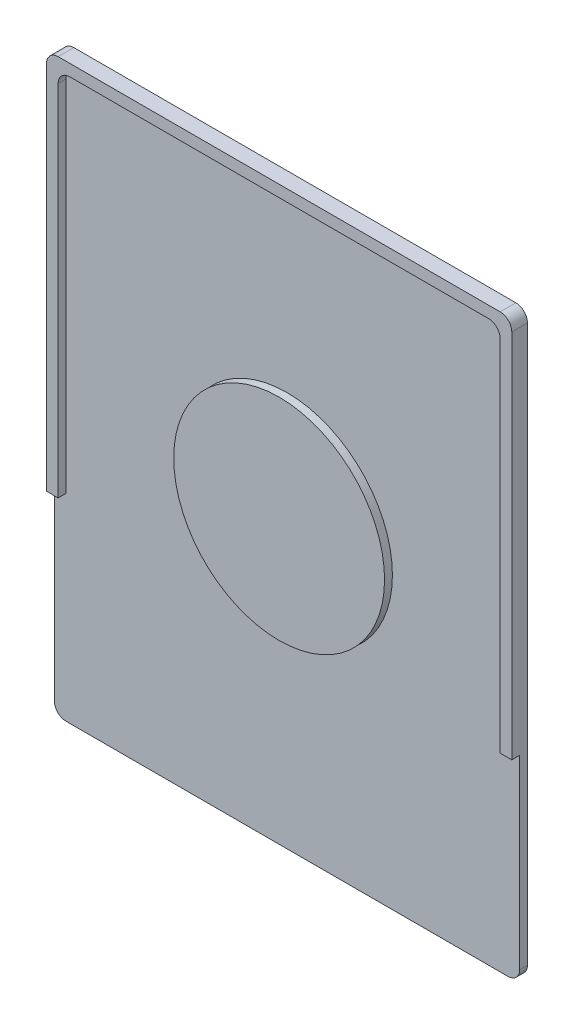
ISO-10303-21;
HEADER;
FILE_DESCRIPTION(('STEP AP214'),'2;1');
FILE_NAME('part.step','',(''),(''),'','','');
FILE_SCHEMA(('AUTOMOTIVE_DESIGN { 1 0 10303 214 1 1 1 1 }'));
ENDSEC;
DATA;
#1=APPLICATION_CONTEXT('core data for automotive mechanical design processes');
#2=APPLICATION_PROTOCOL_DEFINITION('international standard','automotive_design',2000,#1);
#3=PRODUCT_CONTEXT('',#1,'mechanical');
#4=PRODUCT('Part','Part','',(#3));
#5=PRODUCT_RELATED_PRODUCT_CATEGORY('part','',(#4));
#6=PRODUCT_DEFINITION_FORMATION('','',#4);
#7=PRODUCT_DEFINITION_CONTEXT('part definition',#1,'design');
#8=PRODUCT_DEFINITION('design','',#6,#7);
#9=PRODUCT_DEFINITION_SHAPE('','',#8);
#10=(LENGTH_UNIT() NAMED_UNIT(*) SI_UNIT(.MILLI.,.METRE.));
#11=(NAMED_UNIT(*) PLANE_ANGLE_UNIT() SI_UNIT($,.RADIAN.));
#12=(NAMED_UNIT(*) SI_UNIT($,.STERADIAN.) SOLID_ANGLE_UNIT());
#13=UNCERTAINTY_MEASURE_WITH_UNIT(LENGTH_MEASURE(1.E-05),#10,'distance_accuracy_value','');
#14=(GEOMETRIC_REPRESENTATION_CONTEXT(3) GLOBAL_UNCERTAINTY_ASSIGNED_CONTEXT((#13)) GLOBAL_UNIT_ASSIGNED_CONTEXT((#10,
#11,#12)) REPRESENTATION_CONTEXT('',''));
#15=CARTESIAN_POINT('',(0.,0.,0.));
#16=DIRECTION('',(0.,0.,1.));
#17=DIRECTION('',(1.,0.,0.));
#18=AXIS2_PLACEMENT_3D('',#15,#16,#17);
#19=CARTESIAN_POINT('',(-0.00454753032858024,0.318294035489691,0.));
#20=DIRECTION('',(0.,0.,-1.));
#21=DIRECTION('',(-1.,0.,0.));
#22=AXIS2_PLACEMENT_3D('',#19,#20,#21);
#23=PLANE('',#22);
#24=CARTESIAN_POINT('',(75.9954524696714,95.9603037641192,0.));
#25=DIRECTION('',(0.,0.,-1.));
#26=DIRECTION('',(-1.,0.,0.));
#27=AXIS2_PLACEMENT_3D('',#24,#25,#26);
#28=CIRCLE('',#27,36.25);
#29=CARTESIAN_POINT('',(39.7454524696715,95.9603037641192,0.));
#30=VERTEX_POINT('',#29);
#31=EDGE_CURVE('E12',#30,#30,#28,.F.);
#32=ORIENTED_EDGE('',*,*,#31,.F.);
#33=EDGE_LOOP('',(#32));
#34=FACE_BOUND('',#33,.T.);
#35=DIRECTION('',(1.,0.,0.));
#36=VECTOR('',#35,1.);
#37=CARTESIAN_POINT('',(0.,64.1756235658799,0.));
#38=LINE('',#37,#36);
#39=CARTESIAN_POINT('',(-4.00454753032859,64.1756235658799,0.));
#40=VERTEX_POINT('',#39);
#41=CARTESIAN_POINT('',(-0.00454753032853861,64.1756235658799,0.));
#42=VERTEX_POINT('',#41);
#43=EDGE_CURVE('E209',#40,#42,#38,.T.);
#44=ORIENTED_EDGE('',*,*,#43,.F.);
#45=DIRECTION('',(0.,1.,0.));
#46=VECTOR('',#45,1.);
#47=CARTESIAN_POINT('',(-4.00454753032858,0.318294035489691,0.));
#48=LINE('',#47,#46);
#49=CARTESIAN_POINT('',(-4.00454753032858,0.318294035489691,0.));
#50=VERTEX_POINT('',#49);
#51=EDGE_CURVE('E215',#50,#40,#48,.T.);
#52=ORIENTED_EDGE('',*,*,#51,.F.);
#53=CARTESIAN_POINT('',(-0.00454753032858024,0.318294035489691,0.));
#54=DIRECTION('',(0.,0.,-1.));
#55=DIRECTION('',(-1.,0.,0.));
#56=AXIS2_PLACEMENT_3D('',#53,#54,#55);
#57=CIRCLE('',#56,4.);
#58=CARTESIAN_POINT('',(-0.00454753032856636,-3.68170596451031,0.));
#59=VERTEX_POINT('',#58);
#60=EDGE_CURVE('E212',#59,#50,#57,.T.);
#61=ORIENTED_EDGE('',*,*,#60,.F.);
#62=DIRECTION('',(1.,0.,0.));
#63=VECTOR('',#62,1.);
#64=CARTESIAN_POINT('',(-0.00454753032856636,-3.68170596451031,0.));
#65=LINE('',#64,#63);
#66=CARTESIAN_POINT('',(151.995452469671,-3.68170596451031,0.));
#67=VERTEX_POINT('',#66);
#68=EDGE_CURVE('E225',#59,#67,#65,.T.);
#69=ORIENTED_EDGE('',*,*,#68,.T.);
#70=CARTESIAN_POINT('',(151.995452469671,0.318294035489691,0.));
#71=DIRECTION('',(0.,0.,1.));
#72=DIRECTION('',(1.,0.,0.));
#73=AXIS2_PLACEMENT_3D('',#70,#71,#72);
#74=CIRCLE('',#73,4.);
#75=CARTESIAN_POINT('',(155.995452469671,0.318294035489691,0.));
#76=VERTEX_POINT('',#75);
#77=EDGE_CURVE('E247',#67,#76,#74,.T.);
#78=ORIENTED_EDGE('',*,*,#77,.T.);
#79=DIRECTION('',(0.,1.,0.));
#80=VECTOR('',#79,1.);
#81=CARTESIAN_POINT('',(155.995452469671,0.318294035489691,0.));
#82=LINE('',#81,#80);
#83=CARTESIAN_POINT('',(155.995452469671,64.1756235658799,0.));
#84=VERTEX_POINT('',#83);
#85=EDGE_CURVE('E245',#76,#84,#82,.T.);
#86=ORIENTED_EDGE('',*,*,#85,.T.);
#87=DIRECTION('',(1.,0.,0.));
#88=VECTOR('',#87,1.);
#89=CARTESIAN_POINT('',(0.,64.1756235658799,0.));
#90=LINE('',#89,#88);
#91=CARTESIAN_POINT('',(151.995452469671,64.1756235658799,0.));
#92=VERTEX_POINT('',#91);
#93=EDGE_CURVE('E98',#92,#84,#90,.T.);
#94=ORIENTED_EDGE('',*,*,#93,.F.);
#95=DIRECTION('',(0.,-1.,0.));
#96=VECTOR('',#95,1.);
#97=CARTESIAN_POINT('',(151.995452469671,0.,0.));
#98=LINE('',#97,#96);
#99=CARTESIAN_POINT('',(151.995452469671,187.602313492749,0.));
#100=VERTEX_POINT('',#99);
#101=EDGE_CURVE('E293',#100,#92,#98,.T.);
#102=ORIENTED_EDGE('',*,*,#101,.F.);
#103=CARTESIAN_POINT('',(147.995452469671,187.602313492749,0.));
#104=DIRECTION('',(0.,0.,1.));
#105=DIRECTION('',(1.,0.,0.));
#106=AXIS2_PLACEMENT_3D('',#103,#104,#105);
#107=CIRCLE('',#106,4.);
#108=CARTESIAN_POINT('',(147.995452469671,191.602313492749,0.));
#109=VERTEX_POINT('',#108);
#110=EDGE_CURVE('E314',#109,#100,#107,.F.);
#111=ORIENTED_EDGE('',*,*,#110,.F.);
#112=DIRECTION('',(1.,0.,0.));
#113=VECTOR('',#112,1.);
#114=CARTESIAN_POINT('',(0.,191.602313492749,0.));
#115=LINE('',#114,#113);
#116=CARTESIAN_POINT('',(3.99545246967147,191.602313492749,0.));
#117=VERTEX_POINT('',#116);
#118=EDGE_CURVE('E319',#117,#109,#115,.T.);
#119=ORIENTED_EDGE('',*,*,#118,.F.);
#120=CARTESIAN_POINT('',(3.99545246967147,187.602313492749,0.));
#121=DIRECTION('',(0.,0.,1.));
#122=DIRECTION('',(1.,0.,0.));
#123=AXIS2_PLACEMENT_3D('',#120,#121,#122);
#124=CIRCLE('',#123,4.);
#125=CARTESIAN_POINT('',(-0.00454753032853861,187.602313492749,0.));
#126=VERTEX_POINT('',#125);
#127=EDGE_CURVE('E320',#126,#117,#124,.F.);
#128=ORIENTED_EDGE('',*,*,#127,.F.);
#129=DIRECTION('',(0.,1.,0.));
#130=VECTOR('',#129,1.);
#131=CARTESIAN_POINT('',(-0.00454753032853861,0.,0.));
#132=LINE('',#131,#130);
#133=EDGE_CURVE('E91',#42,#126,#132,.T.);
#134=ORIENTED_EDGE('',*,*,#133,.F.);
#135=EDGE_LOOP('',(#44,#52,#61,#69,#78,#86,#94,#102,#111,#119,#128,#134));
#136=FACE_BOUND('',#135,.T.);
#137=ADVANCED_FACE('F76',(#34,#136),#23,.F.);
#138=CARTESIAN_POINT('',(-0.00454753032858024,0.318294035489691,-2.7));
#139=DIRECTION('',(0.,0.,1.));
#140=DIRECTION('',(1.,0.,0.));
#141=AXIS2_PLACEMENT_3D('',#138,#139,#140);
#142=CYLINDRICAL_SURFACE('',#141,4.);
#143=ORIENTED_EDGE('',*,*,#60,.T.);
#144=DIRECTION('',(0.,0.,1.));
#145=VECTOR('',#144,1.);
#146=CARTESIAN_POINT('',(-4.00454753032858,0.318294035489691,-2.7));
#147=LINE('',#146,#145);
#148=CARTESIAN_POINT('',(-4.00454753032858,0.318294035489691,-2.7));
#149=VERTEX_POINT('',#148);
#150=EDGE_CURVE('E84',#149,#50,#147,.T.);
#151=ORIENTED_EDGE('',*,*,#150,.F.);
#152=CARTESIAN_POINT('',(-0.00454753032858024,0.318294035489691,-2.7));
#153=DIRECTION('',(0.,0.,-1.));
#154=DIRECTION('',(-1.,0.,0.));
#155=AXIS2_PLACEMENT_3D('',#152,#153,#154);
#156=CIRCLE('',#155,4.);
#157=CARTESIAN_POINT('',(-0.00454753032856636,-3.68170596451031,-2.7));
#158=VERTEX_POINT('',#157);
#159=EDGE_CURVE('E221',#158,#149,#156,.T.);
#160=ORIENTED_EDGE('',*,*,#159,.F.);
#161=DIRECTION('',(0.,0.,1.));
#162=VECTOR('',#161,1.);
#163=CARTESIAN_POINT('',(-0.00454753032856636,-3.68170596451031,-2.7));
#164=LINE('',#163,#162);
#165=EDGE_CURVE('E241',#158,#59,#164,.T.);
#166=ORIENTED_EDGE('',*,*,#165,.T.);
#167=EDGE_LOOP('',(#143,#151,#160,#166));
#168=FACE_BOUND('',#167,.T.);
#169=ADVANCED_FACE('F78',(#168),#142,.T.);
#170=CARTESIAN_POINT('',(-4.00454753032858,0.318294035489691,-2.7));
#171=DIRECTION('',(1.,0.,0.));
#172=DIRECTION('',(0.,1.,0.));
#173=AXIS2_PLACEMENT_3D('',#170,#171,#172);
#174=PLANE('',#173);
#175=ORIENTED_EDGE('',*,*,#51,.T.);
#176=DIRECTION('',(0.,0.,-1.));
#177=VECTOR('',#176,1.);
#178=CARTESIAN_POINT('',(-4.00454753032859,64.1756235658799,2.7));
#179=LINE('',#178,#177);
#180=CARTESIAN_POINT('',(-4.00454753032859,64.1756235658799,2.7));
#181=VERTEX_POINT('',#180);
#182=EDGE_CURVE('E298',#181,#40,#179,.T.);
#183=ORIENTED_EDGE('',*,*,#182,.F.);
#184=DIRECTION('',(0.,1.,0.));
#185=VECTOR('',#184,1.);
#186=CARTESIAN_POINT('',(-4.00454753032858,0.,2.7));
#187=LINE('',#186,#185);
#188=CARTESIAN_POINT('',(-4.0045475303286,191.602313492749,2.7));
#189=VERTEX_POINT('',#188);
#190=EDGE_CURVE('E327',#181,#189,#187,.T.);
#191=ORIENTED_EDGE('',*,*,#190,.T.);
#192=DIRECTION('',(0.,0.,1.));
#193=VECTOR('',#192,1.);
#194=CARTESIAN_POINT('',(-4.0045475303286,191.602313492749,-2.7));
#195=LINE('',#194,#193);
#196=CARTESIAN_POINT('',(-4.0045475303286,191.602313492749,-2.7));
#197=VERTEX_POINT('',#196);
#198=EDGE_CURVE('E263',#197,#189,#195,.T.);
#199=ORIENTED_EDGE('',*,*,#198,.F.);
#200=DIRECTION('',(0.,1.,0.));
#201=VECTOR('',#200,1.);
#202=CARTESIAN_POINT('',(-4.00454753032858,0.318294035489691,-2.7));
#203=LINE('',#202,#201);
#204=EDGE_CURVE('E224',#149,#197,#203,.T.);
#205=ORIENTED_EDGE('',*,*,#204,.F.);
#206=ORIENTED_EDGE('',*,*,#150,.T.);
#207=EDGE_LOOP('',(#175,#183,#191,#199,#205,#206));
#208=FACE_BOUND('',#207,.T.);
#209=ADVANCED_FACE('F267',(#208),#174,.F.);
#210=CARTESIAN_POINT('',(-0.00454753032856636,191.602313492749,-2.7));
#211=DIRECTION('',(0.,0.,1.));
#212=DIRECTION('',(1.,0.,0.));
#213=AXIS2_PLACEMENT_3D('',#210,#211,#212);
#214=CYLINDRICAL_SURFACE('',#213,4.00000000000002);
#215=ORIENTED_EDGE('',*,*,#198,.T.);
#216=CARTESIAN_POINT('',(-0.00454753032856636,191.602313492749,2.7));
#217=DIRECTION('',(0.,0.,1.));
#218=DIRECTION('',(1.,0.,0.));
#219=AXIS2_PLACEMENT_3D('',#216,#217,#218);
#220=CIRCLE('',#219,4.00000000000002);
#221=CARTESIAN_POINT('',(-0.00454753032856636,195.602313492749,2.7));
#222=VERTEX_POINT('',#221);
#223=EDGE_CURVE('E330',#189,#222,#220,.F.);
#224=ORIENTED_EDGE('',*,*,#223,.T.);
#225=DIRECTION('',(0.,0.,1.));
#226=VECTOR('',#225,1.);
#227=CARTESIAN_POINT('',(-0.00454753032856661,195.602313492749,-2.7));
#228=LINE('',#227,#226);
#229=CARTESIAN_POINT('',(-0.00454753032856661,195.602313492749,-2.7));
#230=VERTEX_POINT('',#229);
#231=EDGE_CURVE('E261',#230,#222,#228,.T.);
#232=ORIENTED_EDGE('',*,*,#231,.F.);
#233=CARTESIAN_POINT('',(-0.00454753032856636,191.602313492749,-2.7));
#234=DIRECTION('',(0.,0.,-1.));
#235=DIRECTION('',(-1.,0.,0.));
#236=AXIS2_PLACEMENT_3D('',#233,#234,#235);
#237=CIRCLE('',#236,4.00000000000002);
#238=EDGE_CURVE('E227',#197,#230,#237,.T.);
#239=ORIENTED_EDGE('',*,*,#238,.F.);
#240=EDGE_LOOP('',(#215,#224,#232,#239));
#241=FACE_BOUND('',#240,.T.);
#242=ADVANCED_FACE('F355',(#241),#214,.T.);
#243=CARTESIAN_POINT('',(-0.00454753032856636,195.602313492749,-2.7));
#244=DIRECTION('',(0.,-1.,0.));
#245=DIRECTION('',(0.,0.,-1.));
#246=AXIS2_PLACEMENT_3D('',#243,#244,#245);
#247=PLANE('',#246);
#248=ORIENTED_EDGE('',*,*,#231,.T.);
#249=DIRECTION('',(1.,0.,0.));
#250=VECTOR('',#249,1.);
#251=CARTESIAN_POINT('',(0.,195.602313492749,2.7));
#252=LINE('',#251,#250);
#253=CARTESIAN_POINT('',(151.995452469671,195.602313492749,2.7));
#254=VERTEX_POINT('',#253);
#255=EDGE_CURVE('E349',#222,#254,#252,.T.);
#256=ORIENTED_EDGE('',*,*,#255,.T.);
#257=DIRECTION('',(0.,0.,1.));
#258=VECTOR('',#257,1.);
#259=CARTESIAN_POINT('',(151.995452469671,195.602313492749,-2.7));
#260=LINE('',#259,#258);
#261=CARTESIAN_POINT('',(151.995452469671,195.602313492749,-2.7));
#262=VERTEX_POINT('',#261);
#263=EDGE_CURVE('E259',#262,#254,#260,.T.);
#264=ORIENTED_EDGE('',*,*,#263,.F.);
#265=DIRECTION('',(1.,0.,0.));
#266=VECTOR('',#265,1.);
#267=CARTESIAN_POINT('',(-0.00454753032856636,195.602313492749,-2.7));
#268=LINE('',#267,#266);
#269=EDGE_CURVE('E229',#230,#262,#268,.T.);
#270=ORIENTED_EDGE('',*,*,#269,.F.);
#271=EDGE_LOOP('',(#248,#256,#264,#270));
#272=FACE_BOUND('',#271,.T.);
#273=ADVANCED_FACE('F392',(#272),#247,.F.);
#274=CARTESIAN_POINT('',(151.995452469671,191.602313492749,-2.7));
#275=DIRECTION('',(0.,0.,1.));
#276=DIRECTION('',(1.,0.,0.));
#277=AXIS2_PLACEMENT_3D('',#274,#275,#276);
#278=CYLINDRICAL_SURFACE('',#277,4.);
#279=ORIENTED_EDGE('',*,*,#263,.T.);
#280=CARTESIAN_POINT('',(151.995452469671,191.602313492749,2.7));
#281=DIRECTION('',(0.,0.,1.));
#282=DIRECTION('',(1.,0.,0.));
#283=AXIS2_PLACEMENT_3D('',#280,#281,#282);
#284=CIRCLE('',#283,4.);
#285=CARTESIAN_POINT('',(155.995452469671,191.602313492749,2.7));
#286=VERTEX_POINT('',#285);
#287=EDGE_CURVE('E346',#254,#286,#284,.F.);
#288=ORIENTED_EDGE('',*,*,#287,.T.);
#289=DIRECTION('',(0.,0.,1.));
#290=VECTOR('',#289,1.);
#291=CARTESIAN_POINT('',(155.995452469671,191.602313492749,-2.7));
#292=LINE('',#291,#290);
#293=CARTESIAN_POINT('',(155.995452469671,191.602313492749,-2.7));
#294=VERTEX_POINT('',#293);
#295=EDGE_CURVE('E257',#294,#286,#292,.T.);
#296=ORIENTED_EDGE('',*,*,#295,.F.);
#297=CARTESIAN_POINT('',(151.995452469671,191.602313492749,-2.7));
#298=DIRECTION('',(0.,0.,-1.));
#299=DIRECTION('',(-1.,0.,0.));
#300=AXIS2_PLACEMENT_3D('',#297,#298,#299);
#301=CIRCLE('',#300,4.);
#302=EDGE_CURVE('E231',#262,#294,#301,.T.);
#303=ORIENTED_EDGE('',*,*,#302,.F.);
#304=EDGE_LOOP('',(#279,#288,#296,#303));
#305=FACE_BOUND('',#304,.T.);
#306=ADVANCED_FACE('F389',(#305),#278,.T.);
#307=CARTESIAN_POINT('',(155.995452469671,0.318294035489691,-2.7));
#308=DIRECTION('',(1.,0.,0.));
#309=DIRECTION('',(0.,0.,-1.));
#310=AXIS2_PLACEMENT_3D('',#307,#308,#309);
#311=PLANE('',#310);
#312=ORIENTED_EDGE('',*,*,#85,.F.);
#313=DIRECTION('',(0.,0.,1.));
#314=VECTOR('',#313,1.);
#315=CARTESIAN_POINT('',(155.995452469671,0.318294035489691,-2.7));
#316=LINE('',#315,#314);
#317=CARTESIAN_POINT('',(155.995452469671,0.318294035489691,-2.7));
#318=VERTEX_POINT('',#317);
#319=EDGE_CURVE('E255',#318,#76,#316,.T.);
#320=ORIENTED_EDGE('',*,*,#319,.F.);
#321=DIRECTION('',(0.,1.,0.));
#322=VECTOR('',#321,1.);
#323=CARTESIAN_POINT('',(155.995452469671,0.318294035489691,-2.7));
#324=LINE('',#323,#322);
#325=EDGE_CURVE('E233',#318,#294,#324,.T.);
#326=ORIENTED_EDGE('',*,*,#325,.T.);
#327=ORIENTED_EDGE('',*,*,#295,.T.);
#328=DIRECTION('',(0.,1.,0.));
#329=VECTOR('',#328,1.);
#330=CARTESIAN_POINT('',(155.995452469671,0.,2.7));
#331=LINE('',#330,#329);
#332=CARTESIAN_POINT('',(155.995452469671,64.1756235658799,2.7));
#333=VERTEX_POINT('',#332);
#334=EDGE_CURVE('E297',#333,#286,#331,.T.);
#335=ORIENTED_EDGE('',*,*,#334,.F.);
#336=DIRECTION('',(0.,0.,-1.));
#337=VECTOR('',#336,1.);
#338=CARTESIAN_POINT('',(155.995452469671,64.1756235658799,2.7));
#339=LINE('',#338,#337);
#340=EDGE_CURVE('E289',#333,#84,#339,.T.);
#341=ORIENTED_EDGE('',*,*,#340,.T.);
#342=EDGE_LOOP('',(#312,#320,#326,#327,#335,#341));
#343=FACE_BOUND('',#342,.T.);
#344=ADVANCED_FACE('F295',(#343),#311,.T.);
#345=CARTESIAN_POINT('',(151.995452469671,0.318294035489691,-2.7));
#346=DIRECTION('',(0.,0.,1.));
#347=DIRECTION('',(1.,0.,0.));
#348=AXIS2_PLACEMENT_3D('',#345,#346,#347);
#349=CYLINDRICAL_SURFACE('',#348,4.);
#350=ORIENTED_EDGE('',*,*,#77,.F.);
#351=DIRECTION('',(0.,0.,1.));
#352=VECTOR('',#351,1.);
#353=CARTESIAN_POINT('',(151.995452469671,-3.68170596451031,-2.7));
#354=LINE('',#353,#352);
#355=CARTESIAN_POINT('',(151.995452469671,-3.68170596451031,-2.7));
#356=VERTEX_POINT('',#355);
#357=EDGE_CURVE('E253',#356,#67,#354,.T.);
#358=ORIENTED_EDGE('',*,*,#357,.F.);
#359=CARTESIAN_POINT('',(151.995452469671,0.318294035489691,-2.7));
#360=DIRECTION('',(0.,0.,1.));
#361=DIRECTION('',(1.,0.,0.));
#362=AXIS2_PLACEMENT_3D('',#359,#360,#361);
#363=CIRCLE('',#362,4.);
#364=EDGE_CURVE('E236',#356,#318,#363,.T.);
#365=ORIENTED_EDGE('',*,*,#364,.T.);
#366=ORIENTED_EDGE('',*,*,#319,.T.);
#367=EDGE_LOOP('',(#350,#358,#365,#366));
#368=FACE_BOUND('',#367,.T.);
#369=ADVANCED_FACE('F280',(#368),#349,.T.);
#370=CARTESIAN_POINT('',(-0.00454753032856636,-3.68170596451031,-2.7));
#371=DIRECTION('',(0.,-1.,0.));
#372=DIRECTION('',(0.,0.,-1.));
#373=AXIS2_PLACEMENT_3D('',#370,#371,#372);
#374=PLANE('',#373);
#375=ORIENTED_EDGE('',*,*,#68,.F.);
#376=ORIENTED_EDGE('',*,*,#165,.F.);
#377=DIRECTION('',(1.,0.,0.));
#378=VECTOR('',#377,1.);
#379=CARTESIAN_POINT('',(-0.00454753032856636,-3.68170596451031,-2.7));
#380=LINE('',#379,#378);
#381=EDGE_CURVE('E239',#158,#356,#380,.T.);
#382=ORIENTED_EDGE('',*,*,#381,.T.);
#383=ORIENTED_EDGE('',*,*,#357,.T.);
#384=EDGE_LOOP('',(#375,#376,#382,#383));
#385=FACE_BOUND('',#384,.T.);
#386=ADVANCED_FACE('F275',(#385),#374,.T.);
#387=CARTESIAN_POINT('',(-0.00454753032858024,0.318294035489691,-2.7));
#388=DIRECTION('',(0.,0.,-1.));
#389=DIRECTION('',(-1.,0.,0.));
#390=AXIS2_PLACEMENT_3D('',#387,#388,#389);
#391=PLANE('',#390);
#392=ORIENTED_EDGE('',*,*,#159,.T.);
#393=ORIENTED_EDGE('',*,*,#204,.T.);
#394=ORIENTED_EDGE('',*,*,#238,.T.);
#395=ORIENTED_EDGE('',*,*,#269,.T.);
#396=ORIENTED_EDGE('',*,*,#302,.T.);
#397=ORIENTED_EDGE('',*,*,#325,.F.);
#398=ORIENTED_EDGE('',*,*,#364,.F.);
#399=ORIENTED_EDGE('',*,*,#381,.F.);
#400=EDGE_LOOP('',(#392,#393,#394,#395,#396,#397,#398,#399));
#401=FACE_BOUND('',#400,.T.);
#402=ADVANCED_FACE('F381',(#401),#391,.T.);
#403=CARTESIAN_POINT('',(-0.00454753032853861,0.,2.7));
#404=DIRECTION('',(-1.,0.,0.));
#405=DIRECTION('',(0.,0.,1.));
#406=AXIS2_PLACEMENT_3D('',#403,#404,#405);
#407=PLANE('',#406);
#408=ORIENTED_EDGE('',*,*,#133,.T.);
#409=DIRECTION('',(0.,0.,-1.));
#410=VECTOR('',#409,1.);
#411=CARTESIAN_POINT('',(-0.00454753032853861,187.602313492749,2.7));
#412=LINE('',#411,#410);
#413=CARTESIAN_POINT('',(-0.00454753032853861,187.602313492749,2.7));
#414=VERTEX_POINT('',#413);
#415=EDGE_CURVE('E193',#414,#126,#412,.T.);
#416=ORIENTED_EDGE('',*,*,#415,.F.);
#417=DIRECTION('',(0.,1.,0.));
#418=VECTOR('',#417,1.);
#419=CARTESIAN_POINT('',(-0.00454753032853861,0.,2.7));
#420=LINE('',#419,#418);
#421=CARTESIAN_POINT('',(-0.00454753032853861,64.1756235658799,2.7));
#422=VERTEX_POINT('',#421);
#423=EDGE_CURVE('E199',#422,#414,#420,.T.);
#424=ORIENTED_EDGE('',*,*,#423,.F.);
#425=DIRECTION('',(0.,0.,-1.));
#426=VECTOR('',#425,1.);
#427=CARTESIAN_POINT('',(-0.00454753032853861,64.1756235658799,2.7));
#428=LINE('',#427,#426);
#429=EDGE_CURVE('E302',#422,#42,#428,.T.);
#430=ORIENTED_EDGE('',*,*,#429,.T.);
#431=EDGE_LOOP('',(#408,#416,#424,#430));
#432=FACE_BOUND('',#431,.T.);
#433=ADVANCED_FACE('F211',(#432),#407,.F.);
#434=CARTESIAN_POINT('',(3.99545246967147,187.602313492749,2.7));
#435=DIRECTION('',(0.,0.,-1.));
#436=DIRECTION('',(-1.,0.,0.));
#437=AXIS2_PLACEMENT_3D('',#434,#435,#436);
#438=CYLINDRICAL_SURFACE('',#437,4.);
#439=ORIENTED_EDGE('',*,*,#127,.T.);
#440=DIRECTION('',(0.,0.,-1.));
#441=VECTOR('',#440,1.);
#442=CARTESIAN_POINT('',(3.99545246967147,191.602313492749,2.7));
#443=LINE('',#442,#441);
#444=CARTESIAN_POINT('',(3.99545246967147,191.602313492749,2.7));
#445=VERTEX_POINT('',#444);
#446=EDGE_CURVE('E195',#445,#117,#443,.T.);
#447=ORIENTED_EDGE('',*,*,#446,.F.);
#448=CARTESIAN_POINT('',(3.99545246967147,187.602313492749,2.7));
#449=DIRECTION('',(0.,0.,1.));
#450=DIRECTION('',(1.,0.,0.));
#451=AXIS2_PLACEMENT_3D('',#448,#449,#450);
#452=CIRCLE('',#451,4.);
#453=EDGE_CURVE('E188',#414,#445,#452,.F.);
#454=ORIENTED_EDGE('',*,*,#453,.F.);
#455=ORIENTED_EDGE('',*,*,#415,.T.);
#456=EDGE_LOOP('',(#439,#447,#454,#455));
#457=FACE_BOUND('',#456,.T.);
#458=ADVANCED_FACE('F191',(#457),#438,.F.);
#459=CARTESIAN_POINT('',(0.,191.602313492749,2.7));
#460=DIRECTION('',(0.,1.,0.));
#461=DIRECTION('',(0.,0.,1.));
#462=AXIS2_PLACEMENT_3D('',#459,#460,#461);
#463=PLANE('',#462);
#464=ORIENTED_EDGE('',*,*,#118,.T.);
#465=DIRECTION('',(0.,0.,-1.));
#466=VECTOR('',#465,1.);
#467=CARTESIAN_POINT('',(147.995452469671,191.602313492749,2.7));
#468=LINE('',#467,#466);
#469=CARTESIAN_POINT('',(147.995452469671,191.602313492749,2.7));
#470=VERTEX_POINT('',#469);
#471=EDGE_CURVE('E217',#470,#109,#468,.T.);
#472=ORIENTED_EDGE('',*,*,#471,.F.);
#473=DIRECTION('',(1.,0.,0.));
#474=VECTOR('',#473,1.);
#475=CARTESIAN_POINT('',(0.,191.602313492749,2.7));
#476=LINE('',#475,#474);
#477=EDGE_CURVE('E198',#445,#470,#476,.T.);
#478=ORIENTED_EDGE('',*,*,#477,.F.);
#479=ORIENTED_EDGE('',*,*,#446,.T.);
#480=EDGE_LOOP('',(#464,#472,#478,#479));
#481=FACE_BOUND('',#480,.T.);
#482=ADVANCED_FACE('F318',(#481),#463,.F.);
#483=CARTESIAN_POINT('',(147.995452469671,187.602313492749,2.7));
#484=DIRECTION('',(0.,0.,-1.));
#485=DIRECTION('',(-1.,0.,0.));
#486=AXIS2_PLACEMENT_3D('',#483,#484,#485);
#487=CYLINDRICAL_SURFACE('',#486,4.);
#488=ORIENTED_EDGE('',*,*,#110,.T.);
#489=DIRECTION('',(0.,0.,-1.));
#490=VECTOR('',#489,1.);
#491=CARTESIAN_POINT('',(151.995452469671,187.602313492749,2.7));
#492=LINE('',#491,#490);
#493=CARTESIAN_POINT('',(151.995452469671,187.602313492749,2.7));
#494=VERTEX_POINT('',#493);
#495=EDGE_CURVE('E300',#494,#100,#492,.T.);
#496=ORIENTED_EDGE('',*,*,#495,.F.);
#497=CARTESIAN_POINT('',(147.995452469671,187.602313492749,2.7));
#498=DIRECTION('',(0.,0.,1.));
#499=DIRECTION('',(1.,0.,0.));
#500=AXIS2_PLACEMENT_3D('',#497,#498,#499);
#501=CIRCLE('',#500,4.);
#502=EDGE_CURVE('E315',#470,#494,#501,.F.);
#503=ORIENTED_EDGE('',*,*,#502,.F.);
#504=ORIENTED_EDGE('',*,*,#471,.T.);
#505=EDGE_LOOP('',(#488,#496,#503,#504));
#506=FACE_BOUND('',#505,.T.);
#507=ADVANCED_FACE('F312',(#506),#487,.F.);
#508=CARTESIAN_POINT('',(151.995452469671,0.,2.7));
#509=DIRECTION('',(1.,0.,0.));
#510=DIRECTION('',(0.,0.,-1.));
#511=AXIS2_PLACEMENT_3D('',#508,#509,#510);
#512=PLANE('',#511);
#513=ORIENTED_EDGE('',*,*,#101,.T.);
#514=DIRECTION('',(0.,0.,-1.));
#515=VECTOR('',#514,1.);
#516=CARTESIAN_POINT('',(151.995452469671,64.1756235658799,2.7));
#517=LINE('',#516,#515);
#518=CARTESIAN_POINT('',(151.995452469671,64.1756235658799,2.7));
#519=VERTEX_POINT('',#518);
#520=EDGE_CURVE('E292',#519,#92,#517,.T.);
#521=ORIENTED_EDGE('',*,*,#520,.F.);
#522=DIRECTION('',(0.,-1.,0.));
#523=VECTOR('',#522,1.);
#524=CARTESIAN_POINT('',(151.995452469671,0.,2.7));
#525=LINE('',#524,#523);
#526=EDGE_CURVE('E341',#494,#519,#525,.T.);
#527=ORIENTED_EDGE('',*,*,#526,.F.);
#528=ORIENTED_EDGE('',*,*,#495,.T.);
#529=EDGE_LOOP('',(#513,#521,#527,#528));
#530=FACE_BOUND('',#529,.T.);
#531=ADVANCED_FACE('F370',(#530),#512,.F.);
#532=CARTESIAN_POINT('',(0.,64.1756235658799,2.7));
#533=DIRECTION('',(0.,1.,0.));
#534=DIRECTION('',(0.,0.,1.));
#535=AXIS2_PLACEMENT_3D('',#532,#533,#534);
#536=PLANE('',#535);
#537=ORIENTED_EDGE('',*,*,#93,.T.);
#538=ORIENTED_EDGE('',*,*,#340,.F.);
#539=DIRECTION('',(1.,0.,0.));
#540=VECTOR('',#539,1.);
#541=CARTESIAN_POINT('',(0.,64.1756235658799,2.7));
#542=LINE('',#541,#540);
#543=EDGE_CURVE('E343',#519,#333,#542,.T.);
#544=ORIENTED_EDGE('',*,*,#543,.F.);
#545=ORIENTED_EDGE('',*,*,#520,.T.);
#546=EDGE_LOOP('',(#537,#538,#544,#545));
#547=FACE_BOUND('',#546,.T.);
#548=ADVANCED_FACE('F287',(#547),#536,.F.);
#549=CARTESIAN_POINT('',(0.,64.1756235658799,2.7));
#550=DIRECTION('',(0.,1.,0.));
#551=DIRECTION('',(0.,0.,1.));
#552=AXIS2_PLACEMENT_3D('',#549,#550,#551);
#553=PLANE('',#552);
#554=ORIENTED_EDGE('',*,*,#43,.T.);
#555=ORIENTED_EDGE('',*,*,#429,.F.);
#556=DIRECTION('',(1.,0.,0.));
#557=VECTOR('',#556,1.);
#558=CARTESIAN_POINT('',(0.,64.1756235658799,2.7));
#559=LINE('',#558,#557);
#560=EDGE_CURVE('E205',#181,#422,#559,.T.);
#561=ORIENTED_EDGE('',*,*,#560,.F.);
#562=ORIENTED_EDGE('',*,*,#182,.T.);
#563=EDGE_LOOP('',(#554,#555,#561,#562));
#564=FACE_BOUND('',#563,.T.);
#565=ADVANCED_FACE('F361',(#564),#553,.F.);
#566=CARTESIAN_POINT('',(0.,0.,2.7));
#567=DIRECTION('',(0.,0.,1.));
#568=DIRECTION('',(1.,0.,0.));
#569=AXIS2_PLACEMENT_3D('',#566,#567,#568);
#570=PLANE('',#569);
#571=ORIENTED_EDGE('',*,*,#423,.T.);
#572=ORIENTED_EDGE('',*,*,#453,.T.);
#573=ORIENTED_EDGE('',*,*,#477,.T.);
#574=ORIENTED_EDGE('',*,*,#502,.T.);
#575=ORIENTED_EDGE('',*,*,#526,.T.);
#576=ORIENTED_EDGE('',*,*,#543,.T.);
#577=ORIENTED_EDGE('',*,*,#334,.T.);
#578=ORIENTED_EDGE('',*,*,#287,.F.);
#579=ORIENTED_EDGE('',*,*,#255,.F.);
#580=ORIENTED_EDGE('',*,*,#223,.F.);
#581=ORIENTED_EDGE('',*,*,#190,.F.);
#582=ORIENTED_EDGE('',*,*,#560,.T.);
#583=EDGE_LOOP('',(#571,#572,#573,#574,#575,#576,#577,#578,#579,#580,#581,#582));
#584=FACE_BOUND('',#583,.T.);
#585=ADVANCED_FACE('F202',(#584),#570,.T.);
#586=CARTESIAN_POINT('',(75.9954524696714,95.9603037641192,2.7));
#587=DIRECTION('',(0.,0.,-1.));
#588=DIRECTION('',(-1.,0.,0.));
#589=AXIS2_PLACEMENT_3D('',#586,#587,#588);
#590=CYLINDRICAL_SURFACE('',#589,36.25);
#591=CARTESIAN_POINT('',(75.9954524696714,95.9603037641192,2.7));
#592=DIRECTION('',(0.,0.,1.));
#593=DIRECTION('',(1.,0.,0.));
#594=AXIS2_PLACEMENT_3D('',#591,#592,#593);
#595=CIRCLE('',#594,36.25);
#596=CARTESIAN_POINT('',(39.7454524696715,95.9603037641192,2.7));
#597=VERTEX_POINT('',#596);
#598=EDGE_CURVE('E333',#597,#597,#595,.T.);
#599=CARTESIAN_POINT('',(39.7454524696715,95.9603037641192,2.7));
#600=CARTESIAN_POINT('',(39.7454524696715,95.9603037641192,2.671875));
#601=CARTESIAN_POINT('',(39.7454524696715,95.9603037641192,2.64375));
#602=CARTESIAN_POINT('',(39.7454524696715,95.9603037641192,2.5875));
#603=CARTESIAN_POINT('',(39.7454524696715,95.9603037641192,2.559375));
#604=CARTESIAN_POINT('',(39.7454524696715,95.9603037641192,2.503125));
#605=CARTESIAN_POINT('',(39.7454524696715,95.9603037641192,2.475));
#606=CARTESIAN_POINT('',(39.7454524696715,95.9603037641192,2.41875));
#607=CARTESIAN_POINT('',(39.7454524696715,95.9603037641192,2.390625));
#608=CARTESIAN_POINT('',(39.7454524696715,95.9603037641192,2.334375));
#609=CARTESIAN_POINT('',(39.7454524696715,95.9603037641192,2.30625));
#610=CARTESIAN_POINT('',(39.7454524696715,95.9603037641192,2.25));
#611=CARTESIAN_POINT('',(39.7454524696715,95.9603037641192,2.221875));
#612=CARTESIAN_POINT('',(39.7454524696715,95.9603037641192,2.165625));
#613=CARTESIAN_POINT('',(39.7454524696715,95.9603037641192,2.1375));
#614=CARTESIAN_POINT('',(39.7454524696715,95.9603037641192,2.08125));
#615=CARTESIAN_POINT('',(39.7454524696715,95.9603037641192,2.053125));
#616=CARTESIAN_POINT('',(39.7454524696715,95.9603037641192,1.996875));
#617=CARTESIAN_POINT('',(39.7454524696715,95.9603037641192,1.96875));
#618=CARTESIAN_POINT('',(39.7454524696715,95.9603037641192,1.9125));
#619=CARTESIAN_POINT('',(39.7454524696715,95.9603037641192,1.884375));
#620=CARTESIAN_POINT('',(39.7454524696715,95.9603037641192,1.828125));
#621=CARTESIAN_POINT('',(39.7454524696715,95.9603037641192,1.8));
#622=CARTESIAN_POINT('',(39.7454524696715,95.9603037641192,1.74375));
#623=CARTESIAN_POINT('',(39.7454524696715,95.9603037641192,1.715625));
#624=CARTESIAN_POINT('',(39.7454524696715,95.9603037641192,1.659375));
#625=CARTESIAN_POINT('',(39.7454524696715,95.9603037641192,1.63125));
#626=CARTESIAN_POINT('',(39.7454524696715,95.9603037641192,1.575));
#627=CARTESIAN_POINT('',(39.7454524696715,95.9603037641192,1.546875));
#628=CARTESIAN_POINT('',(39.7454524696715,95.9603037641192,1.490625));
#629=CARTESIAN_POINT('',(39.7454524696715,95.9603037641192,1.4625));
#630=CARTESIAN_POINT('',(39.7454524696715,95.9603037641192,1.40625));
#631=CARTESIAN_POINT('',(39.7454524696715,95.9603037641192,1.378125));
#632=CARTESIAN_POINT('',(39.7454524696715,95.9603037641192,1.321875));
#633=CARTESIAN_POINT('',(39.7454524696715,95.9603037641192,1.29375));
#634=CARTESIAN_POINT('',(39.7454524696715,95.9603037641192,1.2375));
#635=CARTESIAN_POINT('',(39.7454524696715,95.9603037641192,1.209375));
#636=CARTESIAN_POINT('',(39.7454524696715,95.9603037641192,1.153125));
#637=CARTESIAN_POINT('',(39.7454524696715,95.9603037641192,1.125));
#638=CARTESIAN_POINT('',(39.7454524696715,95.9603037641192,1.06875));
#639=CARTESIAN_POINT('',(39.7454524696715,95.9603037641192,1.040625));
#640=CARTESIAN_POINT('',(39.7454524696715,95.9603037641192,0.984375));
#641=CARTESIAN_POINT('',(39.7454524696715,95.9603037641192,0.95625));
#642=CARTESIAN_POINT('',(39.7454524696715,95.9603037641192,0.9));
#643=CARTESIAN_POINT('',(39.7454524696715,95.9603037641192,0.871875));
#644=CARTESIAN_POINT('',(39.7454524696715,95.9603037641192,0.815625));
#645=CARTESIAN_POINT('',(39.7454524696715,95.9603037641192,0.7875));
#646=CARTESIAN_POINT('',(39.7454524696715,95.9603037641192,0.73125));
#647=CARTESIAN_POINT('',(39.7454524696715,95.9603037641192,0.703125000000001));
#648=CARTESIAN_POINT('',(39.7454524696715,95.9603037641192,0.646875000000001));
#649=CARTESIAN_POINT('',(39.7454524696715,95.9603037641192,0.61875));
#650=CARTESIAN_POINT('',(39.7454524696715,95.9603037641192,0.5625));
#651=CARTESIAN_POINT('',(39.7454524696715,95.9603037641192,0.534375000000001));
#652=CARTESIAN_POINT('',(39.7454524696715,95.9603037641192,0.478125000000001));
#653=CARTESIAN_POINT('',(39.7454524696715,95.9603037641192,0.45));
#654=CARTESIAN_POINT('',(39.7454524696715,95.9603037641192,0.39375));
#655=CARTESIAN_POINT('',(39.7454524696715,95.9603037641192,0.365625));
#656=CARTESIAN_POINT('',(39.7454524696715,95.9603037641192,0.309375));
#657=CARTESIAN_POINT('',(39.7454524696715,95.9603037641192,0.28125));
#658=CARTESIAN_POINT('',(39.7454524696715,95.9603037641192,0.225));
#659=CARTESIAN_POINT('',(39.7454524696715,95.9603037641192,0.196875));
#660=CARTESIAN_POINT('',(39.7454524696715,95.9603037641192,0.140625));
#661=CARTESIAN_POINT('',(39.7454524696715,95.9603037641192,0.1125));
#662=CARTESIAN_POINT('',(39.7454524696715,95.9603037641192,0.0562500000000003));
#663=CARTESIAN_POINT('',(39.7454524696715,95.9603037641192,0.0281250000000003));
#664=CARTESIAN_POINT('',(39.7454524696715,95.9603037641192,0.));
#665=B_SPLINE_CURVE_WITH_KNOTS('',3,(#599,#600,#601,#602,#603,#604,#605,#606,#607,#608,#609,
#610,#611,#612,#613,#614,#615,#616,#617,#618,#619,#620,#621,#622,#623,#624,#625,#626,#627,#628,
#629,#630,#631,#632,#633,#634,#635,#636,#637,#638,#639,#640,#641,#642,#643,#644,#645,#646,#647,
#648,#649,#650,#651,#652,#653,#654,#655,#656,#657,#658,#659,#660,#661,#662,#663,#664),
.UNSPECIFIED.,.F.,.F.,(4,2,2,2,2,2,2,2,2,2,2,2,2,2,2,2,2,2,2,2,2,2,2,2,2,2,2,2,2,2,2,2,4),(0.,
0.0843750000000003,0.16875,0.253125,0.3375,0.421875,0.50625,0.590625,0.675,0.759375,0.84375,
0.928125,1.0125,1.096875,1.18125,1.265625,1.35,1.434375,1.51875,1.603125,1.6875,1.771875,
1.85625,1.940625,2.025,2.109375,2.19375,2.278125,2.3625,2.446875,2.53125,2.615625,2.7),.UNSPECIFIED.);
#666=EDGE_CURVE('BSEAM368',#597,#30,#665,.T.);
#667=ORIENTED_EDGE('',*,*,#598,.F.);
#668=ORIENTED_EDGE('',*,*,#31,.T.);
#669=ORIENTED_EDGE('',*,*,#666,.T.);
#670=ORIENTED_EDGE('',*,*,#666,.F.);
#671=EDGE_LOOP('',(#667,#669,#668,#670));
#672=FACE_BOUND('',#671,.T.);
#673=ADVANCED_FACE('F368',(#672),#590,.T.);
#674=CARTESIAN_POINT('',(0.,0.,2.7));
#675=DIRECTION('',(0.,0.,1.));
#676=DIRECTION('',(1.,0.,0.));
#677=AXIS2_PLACEMENT_3D('',#674,#675,#676);
#678=PLANE('',#677);
#679=ORIENTED_EDGE('',*,*,#598,.T.);
#680=EDGE_LOOP('',(#679));
#681=FACE_BOUND('',#680,.T.);
#682=ADVANCED_FACE('F489',(#681),#678,.T.);
#683=CLOSED_SHELL('',(#137,#169,#209,#242,#273,#306,#344,#369,#386,#402,#433,#458,#482,#507,
#531,#548,#565,#585,#673,#682));
#684=MANIFOLD_SOLID_BREP('B2',#683);
#685=ADVANCED_BREP_SHAPE_REPRESENTATION('',(#18,#684),#14);
#686=SHAPE_DEFINITION_REPRESENTATION(#9,#685);
ENDSEC;
END-ISO-10303-21;
